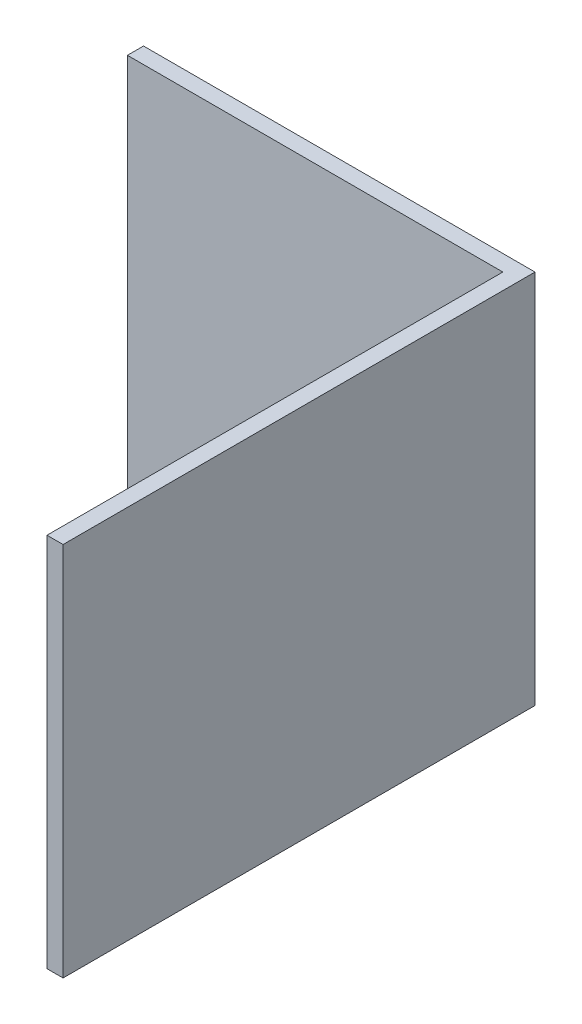
ISO-10303-21;
HEADER;
FILE_DESCRIPTION(('STEP AP214'),'2;1');
FILE_NAME('part.step','',(''),(''),'','','');
FILE_SCHEMA(('AUTOMOTIVE_DESIGN { 1 0 10303 214 1 1 1 1 }'));
ENDSEC;
DATA;
#1=APPLICATION_CONTEXT('core data for automotive mechanical design processes');
#2=APPLICATION_PROTOCOL_DEFINITION('international standard','automotive_design',2000,#1);
#3=PRODUCT_CONTEXT('',#1,'mechanical');
#4=PRODUCT('Part','Part','',(#3));
#5=PRODUCT_RELATED_PRODUCT_CATEGORY('part','',(#4));
#6=PRODUCT_DEFINITION_FORMATION('','',#4);
#7=PRODUCT_DEFINITION_CONTEXT('part definition',#1,'design');
#8=PRODUCT_DEFINITION('design','',#6,#7);
#9=PRODUCT_DEFINITION_SHAPE('','',#8);
#10=(LENGTH_UNIT() NAMED_UNIT(*) SI_UNIT(.MILLI.,.METRE.));
#11=(NAMED_UNIT(*) PLANE_ANGLE_UNIT() SI_UNIT($,.RADIAN.));
#12=(NAMED_UNIT(*) SI_UNIT($,.STERADIAN.) SOLID_ANGLE_UNIT());
#13=UNCERTAINTY_MEASURE_WITH_UNIT(LENGTH_MEASURE(1.E-05),#10,'distance_accuracy_value','');
#14=(GEOMETRIC_REPRESENTATION_CONTEXT(3) GLOBAL_UNCERTAINTY_ASSIGNED_CONTEXT((#13)) GLOBAL_UNIT_ASSIGNED_CONTEXT((#10,
#11,#12)) REPRESENTATION_CONTEXT('',''));
#15=CARTESIAN_POINT('',(0.,0.,0.));
#16=DIRECTION('',(0.,0.,1.));
#17=DIRECTION('',(1.,0.,0.));
#18=AXIS2_PLACEMENT_3D('',#15,#16,#17);
#19=CARTESIAN_POINT('',(-57.9473684210526,70.,-9.44736842105264));
#20=DIRECTION('',(1.,0.,0.));
#21=DIRECTION('',(0.,0.,-1.));
#22=AXIS2_PLACEMENT_3D('',#19,#20,#21);
#23=PLANE('',#22);
#24=DIRECTION('',(0.,0.,1.));
#25=VECTOR('',#24,1.);
#26=CARTESIAN_POINT('',(-57.9473684210526,0.,-9.44736842105264));
#27=LINE('',#26,#25);
#28=CARTESIAN_POINT('',(-57.9473684210526,0.,-9.44736842105264));
#29=VERTEX_POINT('',#28);
#30=CARTESIAN_POINT('',(-57.9473684210526,0.,-6.44736842105264));
#31=VERTEX_POINT('',#30);
#32=EDGE_CURVE('E128',#29,#31,#27,.T.);
#33=ORIENTED_EDGE('',*,*,#32,.T.);
#34=DIRECTION('',(0.,-1.,0.));
#35=VECTOR('',#34,1.);
#36=CARTESIAN_POINT('',(-57.9473684210526,70.,-6.44736842105264));
#37=LINE('',#36,#35);
#38=CARTESIAN_POINT('',(-57.9473684210526,70.,-6.44736842105264));
#39=VERTEX_POINT('',#38);
#40=EDGE_CURVE('E11',#39,#31,#37,.T.);
#41=ORIENTED_EDGE('',*,*,#40,.F.);
#42=DIRECTION('',(0.,0.,1.));
#43=VECTOR('',#42,1.);
#44=CARTESIAN_POINT('',(-57.9473684210526,70.,-9.44736842105264));
#45=LINE('',#44,#43);
#46=CARTESIAN_POINT('',(-57.9473684210526,70.,-9.44736842105264));
#47=VERTEX_POINT('',#46);
#48=EDGE_CURVE('E144',#47,#39,#45,.T.);
#49=ORIENTED_EDGE('',*,*,#48,.F.);
#50=DIRECTION('',(0.,-1.,0.));
#51=VECTOR('',#50,1.);
#52=CARTESIAN_POINT('',(-57.9473684210526,70.,-9.44736842105264));
#53=LINE('',#52,#51);
#54=EDGE_CURVE('E124',#47,#29,#53,.T.);
#55=ORIENTED_EDGE('',*,*,#54,.T.);
#56=EDGE_LOOP('',(#33,#41,#49,#55));
#57=FACE_BOUND('',#56,.T.);
#58=ADVANCED_FACE('F39',(#57),#23,.F.);
#59=CARTESIAN_POINT('',(-57.9473684210526,70.,-6.44736842105264));
#60=DIRECTION('',(0.,0.,-1.));
#61=DIRECTION('',(-1.,0.,0.));
#62=AXIS2_PLACEMENT_3D('',#59,#60,#61);
#63=PLANE('',#62);
#64=DIRECTION('',(1.,0.,0.));
#65=VECTOR('',#64,1.);
#66=CARTESIAN_POINT('',(-57.9473684210526,0.,-6.44736842105264));
#67=LINE('',#66,#65);
#68=CARTESIAN_POINT('',(12.0526315789474,0.,-6.44736842105264));
#69=VERTEX_POINT('',#68);
#70=EDGE_CURVE('E132',#31,#69,#67,.T.);
#71=ORIENTED_EDGE('',*,*,#70,.T.);
#72=DIRECTION('',(0.,-1.,0.));
#73=VECTOR('',#72,1.);
#74=CARTESIAN_POINT('',(12.0526315789474,70.,-6.44736842105264));
#75=LINE('',#74,#73);
#76=CARTESIAN_POINT('',(12.0526315789474,70.,-6.44736842105264));
#77=VERTEX_POINT('',#76);
#78=EDGE_CURVE('E48',#77,#69,#75,.T.);
#79=ORIENTED_EDGE('',*,*,#78,.F.);
#80=DIRECTION('',(1.,0.,0.));
#81=VECTOR('',#80,1.);
#82=CARTESIAN_POINT('',(-57.9473684210526,70.,-6.44736842105264));
#83=LINE('',#82,#81);
#84=EDGE_CURVE('E93',#39,#77,#83,.T.);
#85=ORIENTED_EDGE('',*,*,#84,.F.);
#86=ORIENTED_EDGE('',*,*,#40,.T.);
#87=EDGE_LOOP('',(#71,#79,#85,#86));
#88=FACE_BOUND('',#87,.T.);
#89=ADVANCED_FACE('F172',(#88),#63,.F.);
#90=CARTESIAN_POINT('',(12.0526315789474,70.,-6.44736842105264));
#91=DIRECTION('',(1.,0.,0.));
#92=DIRECTION('',(0.,0.,-1.));
#93=AXIS2_PLACEMENT_3D('',#90,#91,#92);
#94=PLANE('',#93);
#95=DIRECTION('',(0.,0.,1.));
#96=VECTOR('',#95,1.);
#97=CARTESIAN_POINT('',(12.0526315789474,0.,-6.44736842105264));
#98=LINE('',#97,#96);
#99=CARTESIAN_POINT('',(12.0526315789474,0.,78.5526315789473));
#100=VERTEX_POINT('',#99);
#101=EDGE_CURVE('E135',#69,#100,#98,.T.);
#102=ORIENTED_EDGE('',*,*,#101,.T.);
#103=DIRECTION('',(0.,-1.,0.));
#104=VECTOR('',#103,1.);
#105=CARTESIAN_POINT('',(12.0526315789474,70.,78.5526315789473));
#106=LINE('',#105,#104);
#107=CARTESIAN_POINT('',(12.0526315789474,70.,78.5526315789473));
#108=VERTEX_POINT('',#107);
#109=EDGE_CURVE('E117',#108,#100,#106,.T.);
#110=ORIENTED_EDGE('',*,*,#109,.F.);
#111=DIRECTION('',(0.,0.,1.));
#112=VECTOR('',#111,1.);
#113=CARTESIAN_POINT('',(12.0526315789474,70.,-6.44736842105264));
#114=LINE('',#113,#112);
#115=EDGE_CURVE('E106',#77,#108,#114,.T.);
#116=ORIENTED_EDGE('',*,*,#115,.F.);
#117=ORIENTED_EDGE('',*,*,#78,.T.);
#118=EDGE_LOOP('',(#102,#110,#116,#117));
#119=FACE_BOUND('',#118,.T.);
#120=ADVANCED_FACE('F154',(#119),#94,.F.);
#121=CARTESIAN_POINT('',(12.0526315789474,70.,78.5526315789473));
#122=DIRECTION('',(0.,0.,-1.));
#123=DIRECTION('',(-1.,0.,0.));
#124=AXIS2_PLACEMENT_3D('',#121,#122,#123);
#125=PLANE('',#124);
#126=DIRECTION('',(1.,0.,0.));
#127=VECTOR('',#126,1.);
#128=CARTESIAN_POINT('',(12.0526315789474,0.,78.5526315789473));
#129=LINE('',#128,#127);
#130=CARTESIAN_POINT('',(15.0526315789474,0.,78.5526315789473));
#131=VERTEX_POINT('',#130);
#132=EDGE_CURVE('E115',#100,#131,#129,.T.);
#133=ORIENTED_EDGE('',*,*,#132,.T.);
#134=DIRECTION('',(0.,-1.,0.));
#135=VECTOR('',#134,1.);
#136=CARTESIAN_POINT('',(15.0526315789474,70.,78.5526315789473));
#137=LINE('',#136,#135);
#138=CARTESIAN_POINT('',(15.0526315789474,70.,78.5526315789473));
#139=VERTEX_POINT('',#138);
#140=EDGE_CURVE('E112',#139,#131,#137,.T.);
#141=ORIENTED_EDGE('',*,*,#140,.F.);
#142=DIRECTION('',(1.,0.,0.));
#143=VECTOR('',#142,1.);
#144=CARTESIAN_POINT('',(12.0526315789474,70.,78.5526315789473));
#145=LINE('',#144,#143);
#146=EDGE_CURVE('E100',#108,#139,#145,.T.);
#147=ORIENTED_EDGE('',*,*,#146,.F.);
#148=ORIENTED_EDGE('',*,*,#109,.T.);
#149=EDGE_LOOP('',(#133,#141,#147,#148));
#150=FACE_BOUND('',#149,.T.);
#151=ADVANCED_FACE('F113',(#150),#125,.F.);
#152=CARTESIAN_POINT('',(15.0526315789474,70.,78.5526315789473));
#153=DIRECTION('',(-1.,0.,0.));
#154=DIRECTION('',(0.,0.,1.));
#155=AXIS2_PLACEMENT_3D('',#152,#153,#154);
#156=PLANE('',#155);
#157=DIRECTION('',(0.,0.,-1.));
#158=VECTOR('',#157,1.);
#159=CARTESIAN_POINT('',(15.0526315789474,0.,78.5526315789473));
#160=LINE('',#159,#158);
#161=CARTESIAN_POINT('',(15.0526315789474,0.,-9.44736842105265));
#162=VERTEX_POINT('',#161);
#163=EDGE_CURVE('E79',#131,#162,#160,.T.);
#164=ORIENTED_EDGE('',*,*,#163,.T.);
#165=DIRECTION('',(0.,-1.,0.));
#166=VECTOR('',#165,1.);
#167=CARTESIAN_POINT('',(15.0526315789474,70.,-9.44736842105265));
#168=LINE('',#167,#166);
#169=CARTESIAN_POINT('',(15.0526315789474,70.,-9.44736842105265));
#170=VERTEX_POINT('',#169);
#171=EDGE_CURVE('E118',#170,#162,#168,.T.);
#172=ORIENTED_EDGE('',*,*,#171,.F.);
#173=DIRECTION('',(0.,0.,-1.));
#174=VECTOR('',#173,1.);
#175=CARTESIAN_POINT('',(15.0526315789474,70.,78.5526315789473));
#176=LINE('',#175,#174);
#177=EDGE_CURVE('E104',#139,#170,#176,.T.);
#178=ORIENTED_EDGE('',*,*,#177,.F.);
#179=ORIENTED_EDGE('',*,*,#140,.T.);
#180=EDGE_LOOP('',(#164,#172,#178,#179));
#181=FACE_BOUND('',#180,.T.);
#182=ADVANCED_FACE('F120',(#181),#156,.F.);
#183=CARTESIAN_POINT('',(15.0526315789474,70.,-9.44736842105265));
#184=DIRECTION('',(0.,0.,1.));
#185=DIRECTION('',(1.,0.,0.));
#186=AXIS2_PLACEMENT_3D('',#183,#184,#185);
#187=PLANE('',#186);
#188=DIRECTION('',(-1.,0.,0.));
#189=VECTOR('',#188,1.);
#190=CARTESIAN_POINT('',(15.0526315789474,0.,-9.44736842105265));
#191=LINE('',#190,#189);
#192=EDGE_CURVE('E85',#162,#29,#191,.T.);
#193=ORIENTED_EDGE('',*,*,#192,.T.);
#194=ORIENTED_EDGE('',*,*,#54,.F.);
#195=DIRECTION('',(-1.,0.,0.));
#196=VECTOR('',#195,1.);
#197=CARTESIAN_POINT('',(15.0526315789474,70.,-9.44736842105265));
#198=LINE('',#197,#196);
#199=EDGE_CURVE('E56',#170,#47,#198,.T.);
#200=ORIENTED_EDGE('',*,*,#199,.F.);
#201=ORIENTED_EDGE('',*,*,#171,.T.);
#202=EDGE_LOOP('',(#193,#194,#200,#201));
#203=FACE_BOUND('',#202,.T.);
#204=ADVANCED_FACE('F161',(#203),#187,.F.);
#205=CARTESIAN_POINT('',(0.,70.,0.));
#206=DIRECTION('',(0.,1.,0.));
#207=DIRECTION('',(0.,0.,1.));
#208=AXIS2_PLACEMENT_3D('',#205,#206,#207);
#209=PLANE('',#208);
#210=ORIENTED_EDGE('',*,*,#48,.T.);
#211=ORIENTED_EDGE('',*,*,#84,.T.);
#212=ORIENTED_EDGE('',*,*,#115,.T.);
#213=ORIENTED_EDGE('',*,*,#146,.T.);
#214=ORIENTED_EDGE('',*,*,#177,.T.);
#215=ORIENTED_EDGE('',*,*,#199,.T.);
#216=EDGE_LOOP('',(#210,#211,#212,#213,#214,#215));
#217=FACE_BOUND('',#216,.T.);
#218=ADVANCED_FACE('F102',(#217),#209,.T.);
#219=CARTESIAN_POINT('',(0.,0.,0.));
#220=DIRECTION('',(0.,1.,0.));
#221=DIRECTION('',(0.,0.,1.));
#222=AXIS2_PLACEMENT_3D('',#219,#220,#221);
#223=PLANE('',#222);
#224=ORIENTED_EDGE('',*,*,#32,.F.);
#225=ORIENTED_EDGE('',*,*,#192,.F.);
#226=ORIENTED_EDGE('',*,*,#163,.F.);
#227=ORIENTED_EDGE('',*,*,#132,.F.);
#228=ORIENTED_EDGE('',*,*,#101,.F.);
#229=ORIENTED_EDGE('',*,*,#70,.F.);
#230=EDGE_LOOP('',(#224,#225,#226,#227,#228,#229));
#231=FACE_BOUND('',#230,.T.);
#232=ADVANCED_FACE('F157',(#231),#223,.F.);
#233=CLOSED_SHELL('',(#58,#89,#120,#151,#182,#204,#218,#232));
#234=MANIFOLD_SOLID_BREP('B2',#233);
#235=ADVANCED_BREP_SHAPE_REPRESENTATION('',(#18,#234),#14);
#236=SHAPE_DEFINITION_REPRESENTATION(#9,#235);
ENDSEC;
END-ISO-10303-21;
